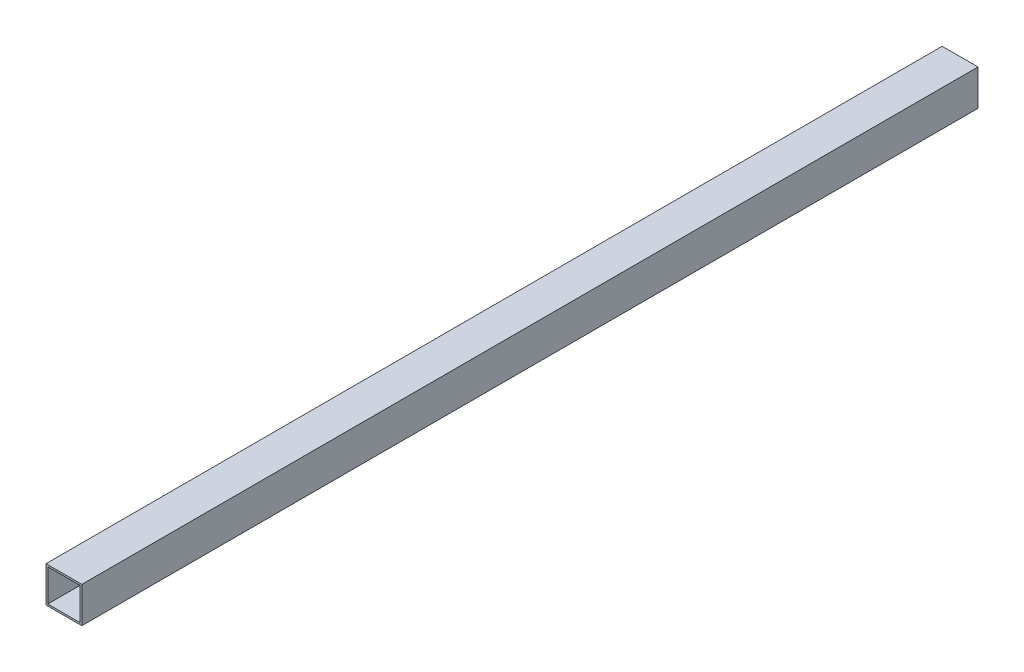
ISO-10303-21;
HEADER;
FILE_DESCRIPTION(('STEP AP214'),'2;1');
FILE_NAME('part.step','',(''),(''),'','','');
FILE_SCHEMA(('AUTOMOTIVE_DESIGN { 1 0 10303 214 1 1 1 1 }'));
ENDSEC;
DATA;
#1=APPLICATION_CONTEXT('core data for automotive mechanical design processes');
#2=APPLICATION_PROTOCOL_DEFINITION('international standard','automotive_design',2000,#1);
#3=PRODUCT_CONTEXT('',#1,'mechanical');
#4=PRODUCT('Part','Part','',(#3));
#5=PRODUCT_RELATED_PRODUCT_CATEGORY('part','',(#4));
#6=PRODUCT_DEFINITION_FORMATION('','',#4);
#7=PRODUCT_DEFINITION_CONTEXT('part definition',#1,'design');
#8=PRODUCT_DEFINITION('design','',#6,#7);
#9=PRODUCT_DEFINITION_SHAPE('','',#8);
#10=(LENGTH_UNIT() NAMED_UNIT(*) SI_UNIT(.MILLI.,.METRE.));
#11=(NAMED_UNIT(*) PLANE_ANGLE_UNIT() SI_UNIT($,.RADIAN.));
#12=(NAMED_UNIT(*) SI_UNIT($,.STERADIAN.) SOLID_ANGLE_UNIT());
#13=UNCERTAINTY_MEASURE_WITH_UNIT(LENGTH_MEASURE(1.E-05),#10,'distance_accuracy_value','');
#14=(GEOMETRIC_REPRESENTATION_CONTEXT(3) GLOBAL_UNCERTAINTY_ASSIGNED_CONTEXT((#13)) GLOBAL_UNIT_ASSIGNED_CONTEXT((#10,
#11,#12)) REPRESENTATION_CONTEXT('',''));
#15=CARTESIAN_POINT('',(0.,0.,0.));
#16=DIRECTION('',(0.,0.,1.));
#17=DIRECTION('',(1.,0.,0.));
#18=AXIS2_PLACEMENT_3D('',#15,#16,#17);
#19=CARTESIAN_POINT('',(-20.,-20.,1000.));
#20=DIRECTION('',(0.,0.,1.));
#21=DIRECTION('',(1.,0.,0.));
#22=AXIS2_PLACEMENT_3D('',#19,#20,#21);
#23=PLANE('',#22);
#24=DIRECTION('',(0.,-1.,0.));
#25=VECTOR('',#24,1.);
#26=CARTESIAN_POINT('',(-20.,-20.,1000.));
#27=LINE('',#26,#25);
#28=CARTESIAN_POINT('',(-20.,20.,1000.));
#29=VERTEX_POINT('',#28);
#30=CARTESIAN_POINT('',(-20.,-20.,1000.));
#31=VERTEX_POINT('',#30);
#32=EDGE_CURVE('E155',#29,#31,#27,.T.);
#33=ORIENTED_EDGE('',*,*,#32,.T.);
#34=DIRECTION('',(1.,0.,0.));
#35=VECTOR('',#34,1.);
#36=CARTESIAN_POINT('',(20.,-20.,1000.));
#37=LINE('',#36,#35);
#38=CARTESIAN_POINT('',(20.,-20.,1000.));
#39=VERTEX_POINT('',#38);
#40=EDGE_CURVE('E158',#31,#39,#37,.T.);
#41=ORIENTED_EDGE('',*,*,#40,.T.);
#42=DIRECTION('',(0.,1.,0.));
#43=VECTOR('',#42,1.);
#44=CARTESIAN_POINT('',(20.,-20.,1000.));
#45=LINE('',#44,#43);
#46=CARTESIAN_POINT('',(20.,20.,1000.));
#47=VERTEX_POINT('',#46);
#48=EDGE_CURVE('E161',#39,#47,#45,.T.);
#49=ORIENTED_EDGE('',*,*,#48,.T.);
#50=DIRECTION('',(-1.,0.,0.));
#51=VECTOR('',#50,1.);
#52=CARTESIAN_POINT('',(20.,20.,1000.));
#53=LINE('',#52,#51);
#54=EDGE_CURVE('E163',#47,#29,#53,.T.);
#55=ORIENTED_EDGE('',*,*,#54,.T.);
#56=EDGE_LOOP('',(#33,#41,#49,#55));
#57=FACE_BOUND('',#56,.T.);
#58=DIRECTION('',(1.,0.,0.));
#59=VECTOR('',#58,1.);
#60=CARTESIAN_POINT('',(20.,-18.,1000.));
#61=LINE('',#60,#59);
#62=CARTESIAN_POINT('',(-18.,-18.,1000.));
#63=VERTEX_POINT('',#62);
#64=CARTESIAN_POINT('',(18.,-18.,1000.));
#65=VERTEX_POINT('',#64);
#66=EDGE_CURVE('E127',#63,#65,#61,.T.);
#67=ORIENTED_EDGE('',*,*,#66,.F.);
#68=DIRECTION('',(0.,-1.,0.));
#69=VECTOR('',#68,1.);
#70=CARTESIAN_POINT('',(-18.,-20.,1000.));
#71=LINE('',#70,#69);
#72=CARTESIAN_POINT('',(-18.,18.,1000.));
#73=VERTEX_POINT('',#72);
#74=EDGE_CURVE('E119',#73,#63,#71,.T.);
#75=ORIENTED_EDGE('',*,*,#74,.F.);
#76=DIRECTION('',(-1.,0.,0.));
#77=VECTOR('',#76,1.);
#78=CARTESIAN_POINT('',(20.,18.,1000.));
#79=LINE('',#78,#77);
#80=CARTESIAN_POINT('',(18.,18.,1000.));
#81=VERTEX_POINT('',#80);
#82=EDGE_CURVE('E141',#81,#73,#79,.T.);
#83=ORIENTED_EDGE('',*,*,#82,.F.);
#84=DIRECTION('',(0.,1.,0.));
#85=VECTOR('',#84,1.);
#86=CARTESIAN_POINT('',(18.,-20.,1000.));
#87=LINE('',#86,#85);
#88=EDGE_CURVE('E139',#65,#81,#87,.T.);
#89=ORIENTED_EDGE('',*,*,#88,.F.);
#90=EDGE_LOOP('',(#67,#75,#83,#89));
#91=FACE_BOUND('',#90,.T.);
#92=ADVANCED_FACE('F54',(#57,#91),#23,.T.);
#93=CARTESIAN_POINT('',(-20.,-20.,0.));
#94=DIRECTION('',(0.,0.,1.));
#95=DIRECTION('',(1.,0.,0.));
#96=AXIS2_PLACEMENT_3D('',#93,#94,#95);
#97=PLANE('',#96);
#98=DIRECTION('',(0.,-1.,0.));
#99=VECTOR('',#98,1.);
#100=CARTESIAN_POINT('',(-20.,-20.,0.));
#101=LINE('',#100,#99);
#102=CARTESIAN_POINT('',(-20.,20.,0.));
#103=VERTEX_POINT('',#102);
#104=CARTESIAN_POINT('',(-20.,-20.,0.));
#105=VERTEX_POINT('',#104);
#106=EDGE_CURVE('E135',#103,#105,#101,.T.);
#107=ORIENTED_EDGE('',*,*,#106,.F.);
#108=DIRECTION('',(-1.,0.,0.));
#109=VECTOR('',#108,1.);
#110=CARTESIAN_POINT('',(20.,20.,0.));
#111=LINE('',#110,#109);
#112=CARTESIAN_POINT('',(20.,20.,0.));
#113=VERTEX_POINT('',#112);
#114=EDGE_CURVE('E159',#113,#103,#111,.T.);
#115=ORIENTED_EDGE('',*,*,#114,.F.);
#116=DIRECTION('',(0.,1.,0.));
#117=VECTOR('',#116,1.);
#118=CARTESIAN_POINT('',(20.,-20.,0.));
#119=LINE('',#118,#117);
#120=CARTESIAN_POINT('',(20.,-20.,0.));
#121=VERTEX_POINT('',#120);
#122=EDGE_CURVE('E170',#121,#113,#119,.T.);
#123=ORIENTED_EDGE('',*,*,#122,.F.);
#124=DIRECTION('',(1.,0.,0.));
#125=VECTOR('',#124,1.);
#126=CARTESIAN_POINT('',(20.,-20.,0.));
#127=LINE('',#126,#125);
#128=EDGE_CURVE('E168',#105,#121,#127,.T.);
#129=ORIENTED_EDGE('',*,*,#128,.F.);
#130=EDGE_LOOP('',(#107,#115,#123,#129));
#131=FACE_BOUND('',#130,.T.);
#132=DIRECTION('',(0.,-1.,0.));
#133=VECTOR('',#132,1.);
#134=CARTESIAN_POINT('',(-18.,-20.,0.));
#135=LINE('',#134,#133);
#136=CARTESIAN_POINT('',(-18.,18.,0.));
#137=VERTEX_POINT('',#136);
#138=CARTESIAN_POINT('',(-18.,-18.,0.));
#139=VERTEX_POINT('',#138);
#140=EDGE_CURVE('E77',#137,#139,#135,.T.);
#141=ORIENTED_EDGE('',*,*,#140,.T.);
#142=DIRECTION('',(1.,0.,0.));
#143=VECTOR('',#142,1.);
#144=CARTESIAN_POINT('',(20.,-18.,0.));
#145=LINE('',#144,#143);
#146=CARTESIAN_POINT('',(18.,-18.,0.));
#147=VERTEX_POINT('',#146);
#148=EDGE_CURVE('E134',#139,#147,#145,.T.);
#149=ORIENTED_EDGE('',*,*,#148,.T.);
#150=DIRECTION('',(0.,1.,0.));
#151=VECTOR('',#150,1.);
#152=CARTESIAN_POINT('',(18.,-20.,0.));
#153=LINE('',#152,#151);
#154=CARTESIAN_POINT('',(18.,18.,0.));
#155=VERTEX_POINT('',#154);
#156=EDGE_CURVE('E147',#147,#155,#153,.T.);
#157=ORIENTED_EDGE('',*,*,#156,.T.);
#158=DIRECTION('',(-1.,0.,0.));
#159=VECTOR('',#158,1.);
#160=CARTESIAN_POINT('',(20.,18.,0.));
#161=LINE('',#160,#159);
#162=EDGE_CURVE('E128',#155,#137,#161,.T.);
#163=ORIENTED_EDGE('',*,*,#162,.T.);
#164=EDGE_LOOP('',(#141,#149,#157,#163));
#165=FACE_BOUND('',#164,.T.);
#166=ADVANCED_FACE('F188',(#131,#165),#97,.F.);
#167=CARTESIAN_POINT('',(-20.,-20.,1000.));
#168=DIRECTION('',(1.,0.,0.));
#169=DIRECTION('',(0.,0.,-1.));
#170=AXIS2_PLACEMENT_3D('',#167,#168,#169);
#171=PLANE('',#170);
#172=ORIENTED_EDGE('',*,*,#106,.T.);
#173=DIRECTION('',(0.,0.,-1.));
#174=VECTOR('',#173,1.);
#175=CARTESIAN_POINT('',(-20.,-20.,1000.));
#176=LINE('',#175,#174);
#177=EDGE_CURVE('E12',#31,#105,#176,.T.);
#178=ORIENTED_EDGE('',*,*,#177,.F.);
#179=ORIENTED_EDGE('',*,*,#32,.F.);
#180=DIRECTION('',(0.,0.,-1.));
#181=VECTOR('',#180,1.);
#182=CARTESIAN_POINT('',(-20.,20.,1000.));
#183=LINE('',#182,#181);
#184=EDGE_CURVE('E165',#29,#103,#183,.T.);
#185=ORIENTED_EDGE('',*,*,#184,.T.);
#186=EDGE_LOOP('',(#172,#178,#179,#185));
#187=FACE_BOUND('',#186,.T.);
#188=ADVANCED_FACE('F56',(#187),#171,.F.);
#189=CARTESIAN_POINT('',(20.,-20.,1000.));
#190=DIRECTION('',(0.,1.,0.));
#191=DIRECTION('',(-1.,0.,0.));
#192=AXIS2_PLACEMENT_3D('',#189,#190,#191);
#193=PLANE('',#192);
#194=ORIENTED_EDGE('',*,*,#128,.T.);
#195=DIRECTION('',(0.,0.,-1.));
#196=VECTOR('',#195,1.);
#197=CARTESIAN_POINT('',(20.,-20.,1000.));
#198=LINE('',#197,#196);
#199=EDGE_CURVE('E62',#39,#121,#198,.T.);
#200=ORIENTED_EDGE('',*,*,#199,.F.);
#201=ORIENTED_EDGE('',*,*,#40,.F.);
#202=ORIENTED_EDGE('',*,*,#177,.T.);
#203=EDGE_LOOP('',(#194,#200,#201,#202));
#204=FACE_BOUND('',#203,.T.);
#205=ADVANCED_FACE('F198',(#204),#193,.F.);
#206=CARTESIAN_POINT('',(20.,-20.,1000.));
#207=DIRECTION('',(-1.,0.,0.));
#208=DIRECTION('',(0.,0.,1.));
#209=AXIS2_PLACEMENT_3D('',#206,#207,#208);
#210=PLANE('',#209);
#211=ORIENTED_EDGE('',*,*,#122,.T.);
#212=DIRECTION('',(0.,0.,-1.));
#213=VECTOR('',#212,1.);
#214=CARTESIAN_POINT('',(20.,20.,1000.));
#215=LINE('',#214,#213);
#216=EDGE_CURVE('E175',#47,#113,#215,.T.);
#217=ORIENTED_EDGE('',*,*,#216,.F.);
#218=ORIENTED_EDGE('',*,*,#48,.F.);
#219=ORIENTED_EDGE('',*,*,#199,.T.);
#220=EDGE_LOOP('',(#211,#217,#218,#219));
#221=FACE_BOUND('',#220,.T.);
#222=ADVANCED_FACE('F182',(#221),#210,.F.);
#223=CARTESIAN_POINT('',(20.,20.,1000.));
#224=DIRECTION('',(0.,-1.,0.));
#225=DIRECTION('',(1.,0.,0.));
#226=AXIS2_PLACEMENT_3D('',#223,#224,#225);
#227=PLANE('',#226);
#228=ORIENTED_EDGE('',*,*,#114,.T.);
#229=ORIENTED_EDGE('',*,*,#184,.F.);
#230=ORIENTED_EDGE('',*,*,#54,.F.);
#231=ORIENTED_EDGE('',*,*,#216,.T.);
#232=EDGE_LOOP('',(#228,#229,#230,#231));
#233=FACE_BOUND('',#232,.T.);
#234=ADVANCED_FACE('F192',(#233),#227,.F.);
#235=CARTESIAN_POINT('',(-18.,-20.,1000.));
#236=DIRECTION('',(1.,0.,0.));
#237=DIRECTION('',(0.,0.,-1.));
#238=AXIS2_PLACEMENT_3D('',#235,#236,#237);
#239=PLANE('',#238);
#240=ORIENTED_EDGE('',*,*,#140,.F.);
#241=DIRECTION('',(0.,0.,-1.));
#242=VECTOR('',#241,1.);
#243=CARTESIAN_POINT('',(-18.,18.,1000.));
#244=LINE('',#243,#242);
#245=EDGE_CURVE('E123',#73,#137,#244,.T.);
#246=ORIENTED_EDGE('',*,*,#245,.F.);
#247=ORIENTED_EDGE('',*,*,#74,.T.);
#248=DIRECTION('',(0.,0.,-1.));
#249=VECTOR('',#248,1.);
#250=CARTESIAN_POINT('',(-18.,-18.,1000.));
#251=LINE('',#250,#249);
#252=EDGE_CURVE('E122',#63,#139,#251,.T.);
#253=ORIENTED_EDGE('',*,*,#252,.T.);
#254=EDGE_LOOP('',(#240,#246,#247,#253));
#255=FACE_BOUND('',#254,.T.);
#256=ADVANCED_FACE('F121',(#255),#239,.T.);
#257=CARTESIAN_POINT('',(20.,-18.,1000.));
#258=DIRECTION('',(0.,1.,0.));
#259=DIRECTION('',(-1.,0.,0.));
#260=AXIS2_PLACEMENT_3D('',#257,#258,#259);
#261=PLANE('',#260);
#262=ORIENTED_EDGE('',*,*,#148,.F.);
#263=ORIENTED_EDGE('',*,*,#252,.F.);
#264=ORIENTED_EDGE('',*,*,#66,.T.);
#265=DIRECTION('',(0.,0.,-1.));
#266=VECTOR('',#265,1.);
#267=CARTESIAN_POINT('',(18.,-18.,1000.));
#268=LINE('',#267,#266);
#269=EDGE_CURVE('E136',#65,#147,#268,.T.);
#270=ORIENTED_EDGE('',*,*,#269,.T.);
#271=EDGE_LOOP('',(#262,#263,#264,#270));
#272=FACE_BOUND('',#271,.T.);
#273=ADVANCED_FACE('F131',(#272),#261,.T.);
#274=CARTESIAN_POINT('',(18.,-20.,1000.));
#275=DIRECTION('',(-1.,0.,0.));
#276=DIRECTION('',(0.,0.,1.));
#277=AXIS2_PLACEMENT_3D('',#274,#275,#276);
#278=PLANE('',#277);
#279=ORIENTED_EDGE('',*,*,#156,.F.);
#280=ORIENTED_EDGE('',*,*,#269,.F.);
#281=ORIENTED_EDGE('',*,*,#88,.T.);
#282=DIRECTION('',(0.,0.,-1.));
#283=VECTOR('',#282,1.);
#284=CARTESIAN_POINT('',(18.,18.,1000.));
#285=LINE('',#284,#283);
#286=EDGE_CURVE('E69',#81,#155,#285,.T.);
#287=ORIENTED_EDGE('',*,*,#286,.T.);
#288=EDGE_LOOP('',(#279,#280,#281,#287));
#289=FACE_BOUND('',#288,.T.);
#290=ADVANCED_FACE('F221',(#289),#278,.T.);
#291=CARTESIAN_POINT('',(20.,18.,1000.));
#292=DIRECTION('',(0.,-1.,0.));
#293=DIRECTION('',(1.,0.,0.));
#294=AXIS2_PLACEMENT_3D('',#291,#292,#293);
#295=PLANE('',#294);
#296=ORIENTED_EDGE('',*,*,#162,.F.);
#297=ORIENTED_EDGE('',*,*,#286,.F.);
#298=ORIENTED_EDGE('',*,*,#82,.T.);
#299=ORIENTED_EDGE('',*,*,#245,.T.);
#300=EDGE_LOOP('',(#296,#297,#298,#299));
#301=FACE_BOUND('',#300,.T.);
#302=ADVANCED_FACE('F225',(#301),#295,.T.);
#303=CLOSED_SHELL('',(#92,#166,#188,#205,#222,#234,#256,#273,#290,#302));
#304=MANIFOLD_SOLID_BREP('B2',#303);
#305=ADVANCED_BREP_SHAPE_REPRESENTATION('',(#18,#304),#14);
#306=SHAPE_DEFINITION_REPRESENTATION(#9,#305);
ENDSEC;
END-ISO-10303-21;
